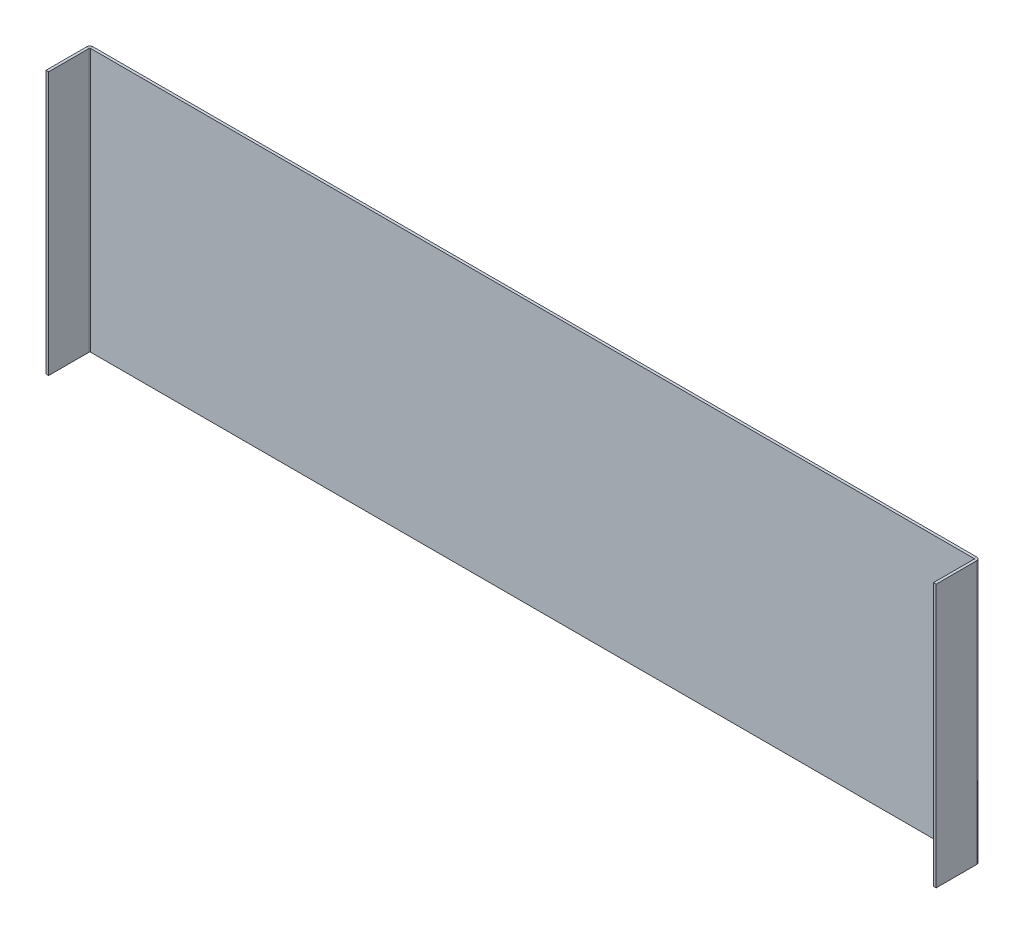
ISO-10303-21;
HEADER;
FILE_DESCRIPTION(('STEP AP214'),'2;1');
FILE_NAME('part.step','',(''),(''),'','','');
FILE_SCHEMA(('AUTOMOTIVE_DESIGN { 1 0 10303 214 1 1 1 1 }'));
ENDSEC;
DATA;
#1=APPLICATION_CONTEXT('core data for automotive mechanical design processes');
#2=APPLICATION_PROTOCOL_DEFINITION('international standard','automotive_design',2000,#1);
#3=PRODUCT_CONTEXT('',#1,'mechanical');
#4=PRODUCT('Part','Part','',(#3));
#5=PRODUCT_RELATED_PRODUCT_CATEGORY('part','',(#4));
#6=PRODUCT_DEFINITION_FORMATION('','',#4);
#7=PRODUCT_DEFINITION_CONTEXT('part definition',#1,'design');
#8=PRODUCT_DEFINITION('design','',#6,#7);
#9=PRODUCT_DEFINITION_SHAPE('','',#8);
#10=(LENGTH_UNIT() NAMED_UNIT(*) SI_UNIT(.MILLI.,.METRE.));
#11=(NAMED_UNIT(*) PLANE_ANGLE_UNIT() SI_UNIT($,.RADIAN.));
#12=(NAMED_UNIT(*) SI_UNIT($,.STERADIAN.) SOLID_ANGLE_UNIT());
#13=UNCERTAINTY_MEASURE_WITH_UNIT(LENGTH_MEASURE(1.E-05),#10,'distance_accuracy_value','');
#14=(GEOMETRIC_REPRESENTATION_CONTEXT(3) GLOBAL_UNCERTAINTY_ASSIGNED_CONTEXT((#13)) GLOBAL_UNIT_ASSIGNED_CONTEXT((#10,
#11,#12)) REPRESENTATION_CONTEXT('',''));
#15=CARTESIAN_POINT('',(0.,0.,0.));
#16=DIRECTION('',(0.,0.,1.));
#17=DIRECTION('',(1.,0.,0.));
#18=AXIS2_PLACEMENT_3D('',#15,#16,#17);
#19=CARTESIAN_POINT('',(-503.750000000009,150.,0.));
#20=DIRECTION('',(0.,1.,0.));
#21=DIRECTION('',(0.,0.,1.));
#22=AXIS2_PLACEMENT_3D('',#19,#20,#21);
#23=PLANE('',#22);
#24=DIRECTION('',(0.,0.,1.));
#25=VECTOR('',#24,1.);
#26=CARTESIAN_POINT('',(-503.750000000009,150.,0.));
#27=LINE('',#26,#25);
#28=CARTESIAN_POINT('',(-503.750000000009,150.,0.));
#29=VERTEX_POINT('',#28);
#30=CARTESIAN_POINT('',(-503.750000000009,150.,3.00000000000001));
#31=VERTEX_POINT('',#30);
#32=EDGE_CURVE('E11',#29,#31,#27,.T.);
#33=ORIENTED_EDGE('',*,*,#32,.F.);
#34=CARTESIAN_POINT('',(-503.750000000009,150.,3.75000000000002));
#35=DIRECTION('',(0.,1.,0.));
#36=DIRECTION('',(0.,0.,1.));
#37=AXIS2_PLACEMENT_3D('',#34,#35,#36);
#38=CIRCLE('',#37,3.75);
#39=CARTESIAN_POINT('',(-507.500000000009,150.,3.75000000000002));
#40=VERTEX_POINT('',#39);
#41=EDGE_CURVE('E247',#40,#29,#38,.F.);
#42=ORIENTED_EDGE('',*,*,#41,.F.);
#43=DIRECTION('',(-1.,0.,0.));
#44=VECTOR('',#43,1.);
#45=CARTESIAN_POINT('',(-504.500000000009,150.,3.75000000000002));
#46=LINE('',#45,#44);
#47=CARTESIAN_POINT('',(-504.500000000009,150.,3.75000000000002));
#48=VERTEX_POINT('',#47);
#49=EDGE_CURVE('E45',#48,#40,#46,.T.);
#50=ORIENTED_EDGE('',*,*,#49,.F.);
#51=CARTESIAN_POINT('',(-503.750000000009,150.,3.75000000000002));
#52=DIRECTION('',(0.,1.,0.));
#53=DIRECTION('',(1.,0.,0.));
#54=AXIS2_PLACEMENT_3D('',#51,#52,#53);
#55=CIRCLE('',#54,0.75);
#56=EDGE_CURVE('E146',#48,#31,#55,.F.);
#57=ORIENTED_EDGE('',*,*,#56,.T.);
#58=EDGE_LOOP('',(#33,#42,#50,#57));
#59=FACE_BOUND('',#58,.T.);
#60=ADVANCED_FACE('F37',(#59),#23,.T.);
#61=CARTESIAN_POINT('',(-504.500000000009,150.,3.75000000000002));
#62=DIRECTION('',(0.,1.,0.));
#63=DIRECTION('',(0.,0.,1.));
#64=AXIS2_PLACEMENT_3D('',#61,#62,#63);
#65=PLANE('',#64);
#66=DIRECTION('',(1.,0.,0.));
#67=VECTOR('',#66,1.);
#68=CARTESIAN_POINT('',(-507.500000000009,150.,0.));
#69=LINE('',#68,#67);
#70=CARTESIAN_POINT('',(503.750000000007,150.,0.));
#71=VERTEX_POINT('',#70);
#72=EDGE_CURVE('E140',#29,#71,#69,.T.);
#73=ORIENTED_EDGE('',*,*,#72,.F.);
#74=ORIENTED_EDGE('',*,*,#32,.T.);
#75=DIRECTION('',(1.,0.,0.));
#76=VECTOR('',#75,1.);
#77=CARTESIAN_POINT('',(-507.500000000009,150.,3.00000000000001));
#78=LINE('',#77,#76);
#79=CARTESIAN_POINT('',(503.750000000007,150.,3.00000000000001));
#80=VERTEX_POINT('',#79);
#81=EDGE_CURVE('E137',#31,#80,#78,.T.);
#82=ORIENTED_EDGE('',*,*,#81,.T.);
#83=DIRECTION('',(0.,0.,-1.));
#84=VECTOR('',#83,1.);
#85=CARTESIAN_POINT('',(503.750000000007,150.,3.00000000000001));
#86=LINE('',#85,#84);
#87=EDGE_CURVE('E228',#80,#71,#86,.T.);
#88=ORIENTED_EDGE('',*,*,#87,.T.);
#89=EDGE_LOOP('',(#73,#74,#82,#88));
#90=FACE_BOUND('',#89,.T.);
#91=ADVANCED_FACE('F135',(#90),#65,.T.);
#92=CARTESIAN_POINT('',(-507.500000000009,-150.,3.75000000000002));
#93=DIRECTION('',(0.,-1.,0.));
#94=DIRECTION('',(0.,0.,-1.));
#95=AXIS2_PLACEMENT_3D('',#92,#93,#94);
#96=PLANE('',#95);
#97=DIRECTION('',(1.,0.,0.));
#98=VECTOR('',#97,1.);
#99=CARTESIAN_POINT('',(-507.500000000009,-150.,3.75000000000002));
#100=LINE('',#99,#98);
#101=CARTESIAN_POINT('',(-507.500000000009,-150.,3.75000000000002));
#102=VERTEX_POINT('',#101);
#103=CARTESIAN_POINT('',(-504.500000000009,-150.,3.75000000000002));
#104=VERTEX_POINT('',#103);
#105=EDGE_CURVE('E233',#102,#104,#100,.T.);
#106=ORIENTED_EDGE('',*,*,#105,.F.);
#107=CARTESIAN_POINT('',(-503.750000000009,-150.,3.75000000000002));
#108=DIRECTION('',(0.,1.,0.));
#109=DIRECTION('',(0.,0.,1.));
#110=AXIS2_PLACEMENT_3D('',#107,#108,#109);
#111=CIRCLE('',#110,3.75);
#112=CARTESIAN_POINT('',(-503.750000000009,-150.,0.));
#113=VERTEX_POINT('',#112);
#114=EDGE_CURVE('E185',#102,#113,#111,.F.);
#115=ORIENTED_EDGE('',*,*,#114,.T.);
#116=DIRECTION('',(0.,0.,-1.));
#117=VECTOR('',#116,1.);
#118=CARTESIAN_POINT('',(-503.750000000009,-150.,3.00000000000001));
#119=LINE('',#118,#117);
#120=CARTESIAN_POINT('',(-503.750000000009,-150.,3.00000000000001));
#121=VERTEX_POINT('',#120);
#122=EDGE_CURVE('E231',#121,#113,#119,.T.);
#123=ORIENTED_EDGE('',*,*,#122,.F.);
#124=CARTESIAN_POINT('',(-503.750000000009,-150.,3.75000000000002));
#125=DIRECTION('',(0.,1.,0.));
#126=DIRECTION('',(1.,0.,0.));
#127=AXIS2_PLACEMENT_3D('',#124,#125,#126);
#128=CIRCLE('',#127,0.75);
#129=EDGE_CURVE('E158',#104,#121,#128,.F.);
#130=ORIENTED_EDGE('',*,*,#129,.F.);
#131=EDGE_LOOP('',(#106,#115,#123,#130));
#132=FACE_BOUND('',#131,.T.);
#133=ADVANCED_FACE('F285',(#132),#96,.T.);
#134=CARTESIAN_POINT('',(-503.750000000009,-150.,3.00000000000001));
#135=DIRECTION('',(0.,-1.,0.));
#136=DIRECTION('',(0.,0.,-1.));
#137=AXIS2_PLACEMENT_3D('',#134,#135,#136);
#138=PLANE('',#137);
#139=DIRECTION('',(0.,0.,-1.));
#140=VECTOR('',#139,1.);
#141=CARTESIAN_POINT('',(-507.500000000009,-150.,50.));
#142=LINE('',#141,#140);
#143=CARTESIAN_POINT('',(-507.500000000009,-150.,50.));
#144=VERTEX_POINT('',#143);
#145=EDGE_CURVE('E188',#144,#102,#142,.T.);
#146=ORIENTED_EDGE('',*,*,#145,.T.);
#147=ORIENTED_EDGE('',*,*,#105,.T.);
#148=DIRECTION('',(0.,0.,-1.));
#149=VECTOR('',#148,1.);
#150=CARTESIAN_POINT('',(-504.500000000009,-150.,50.));
#151=LINE('',#150,#149);
#152=CARTESIAN_POINT('',(-504.500000000009,-150.,50.));
#153=VERTEX_POINT('',#152);
#154=EDGE_CURVE('E194',#153,#104,#151,.T.);
#155=ORIENTED_EDGE('',*,*,#154,.F.);
#156=DIRECTION('',(-1.,0.,0.));
#157=VECTOR('',#156,1.);
#158=CARTESIAN_POINT('',(-504.500000000009,-150.,50.));
#159=LINE('',#158,#157);
#160=EDGE_CURVE('E191',#153,#144,#159,.T.);
#161=ORIENTED_EDGE('',*,*,#160,.T.);
#162=EDGE_LOOP('',(#146,#147,#155,#161));
#163=FACE_BOUND('',#162,.T.);
#164=ADVANCED_FACE('F288',(#163),#138,.T.);
#165=CARTESIAN_POINT('',(507.500000000007,150.,3.75000000000001));
#166=DIRECTION('',(0.,1.,0.));
#167=DIRECTION('',(0.,0.,1.));
#168=AXIS2_PLACEMENT_3D('',#165,#166,#167);
#169=PLANE('',#168);
#170=DIRECTION('',(-1.,0.,0.));
#171=VECTOR('',#170,1.);
#172=CARTESIAN_POINT('',(507.500000000007,150.,3.75000000000001));
#173=LINE('',#172,#171);
#174=CARTESIAN_POINT('',(507.500000000007,150.,3.75000000000001));
#175=VERTEX_POINT('',#174);
#176=CARTESIAN_POINT('',(504.500000000007,150.,3.75000000000001));
#177=VERTEX_POINT('',#176);
#178=EDGE_CURVE('E53',#175,#177,#173,.T.);
#179=ORIENTED_EDGE('',*,*,#178,.F.);
#180=CARTESIAN_POINT('',(503.750000000007,150.,3.75000000000001));
#181=DIRECTION('',(0.,1.,0.));
#182=DIRECTION('',(0.,0.,1.));
#183=AXIS2_PLACEMENT_3D('',#180,#181,#182);
#184=CIRCLE('',#183,3.75);
#185=EDGE_CURVE('E257',#71,#175,#184,.F.);
#186=ORIENTED_EDGE('',*,*,#185,.F.);
#187=ORIENTED_EDGE('',*,*,#87,.F.);
#188=CARTESIAN_POINT('',(503.750000000007,150.,3.75000000000001));
#189=DIRECTION('',(0.,1.,0.));
#190=DIRECTION('',(1.,0.,0.));
#191=AXIS2_PLACEMENT_3D('',#188,#189,#190);
#192=CIRCLE('',#191,0.75);
#193=EDGE_CURVE('E166',#80,#177,#192,.F.);
#194=ORIENTED_EDGE('',*,*,#193,.T.);
#195=EDGE_LOOP('',(#179,#186,#187,#194));
#196=FACE_BOUND('',#195,.T.);
#197=ADVANCED_FACE('F280',(#196),#169,.T.);
#198=CARTESIAN_POINT('',(503.750000000007,150.,3.00000000000001));
#199=DIRECTION('',(0.,1.,0.));
#200=DIRECTION('',(0.,0.,1.));
#201=AXIS2_PLACEMENT_3D('',#198,#199,#200);
#202=PLANE('',#201);
#203=DIRECTION('',(0.,0.,1.));
#204=VECTOR('',#203,1.);
#205=CARTESIAN_POINT('',(507.500000000007,150.,0.));
#206=LINE('',#205,#204);
#207=CARTESIAN_POINT('',(507.500000000007,150.,50.));
#208=VERTEX_POINT('',#207);
#209=EDGE_CURVE('E260',#175,#208,#206,.T.);
#210=ORIENTED_EDGE('',*,*,#209,.F.);
#211=ORIENTED_EDGE('',*,*,#178,.T.);
#212=DIRECTION('',(0.,0.,-1.));
#213=VECTOR('',#212,1.);
#214=CARTESIAN_POINT('',(504.500000000007,150.,0.));
#215=LINE('',#214,#213);
#216=CARTESIAN_POINT('',(504.500000000007,150.,50.));
#217=VERTEX_POINT('',#216);
#218=EDGE_CURVE('E107',#177,#217,#215,.F.);
#219=ORIENTED_EDGE('',*,*,#218,.T.);
#220=DIRECTION('',(-1.,0.,0.));
#221=VECTOR('',#220,1.);
#222=CARTESIAN_POINT('',(507.500000000007,150.,50.));
#223=LINE('',#222,#221);
#224=EDGE_CURVE('E263',#208,#217,#223,.T.);
#225=ORIENTED_EDGE('',*,*,#224,.F.);
#226=EDGE_LOOP('',(#210,#211,#219,#225));
#227=FACE_BOUND('',#226,.T.);
#228=ADVANCED_FACE('F269',(#227),#202,.T.);
#229=CARTESIAN_POINT('',(503.750000000007,-150.,0.));
#230=DIRECTION('',(0.,-1.,0.));
#231=DIRECTION('',(0.,0.,-1.));
#232=AXIS2_PLACEMENT_3D('',#229,#230,#231);
#233=PLANE('',#232);
#234=DIRECTION('',(0.,0.,1.));
#235=VECTOR('',#234,1.);
#236=CARTESIAN_POINT('',(503.750000000007,-150.,0.));
#237=LINE('',#236,#235);
#238=CARTESIAN_POINT('',(503.750000000007,-150.,0.));
#239=VERTEX_POINT('',#238);
#240=CARTESIAN_POINT('',(503.750000000007,-150.,3.00000000000001));
#241=VERTEX_POINT('',#240);
#242=EDGE_CURVE('E94',#239,#241,#237,.T.);
#243=ORIENTED_EDGE('',*,*,#242,.F.);
#244=CARTESIAN_POINT('',(503.750000000007,-150.,3.75000000000001));
#245=DIRECTION('',(0.,1.,0.));
#246=DIRECTION('',(0.,0.,1.));
#247=AXIS2_PLACEMENT_3D('',#244,#245,#246);
#248=CIRCLE('',#247,3.75);
#249=CARTESIAN_POINT('',(507.500000000007,-150.,3.75000000000001));
#250=VERTEX_POINT('',#249);
#251=EDGE_CURVE('E181',#239,#250,#248,.F.);
#252=ORIENTED_EDGE('',*,*,#251,.T.);
#253=DIRECTION('',(1.,0.,0.));
#254=VECTOR('',#253,1.);
#255=CARTESIAN_POINT('',(504.500000000007,-150.,3.75000000000001));
#256=LINE('',#255,#254);
#257=CARTESIAN_POINT('',(504.500000000007,-150.,3.75000000000001));
#258=VERTEX_POINT('',#257);
#259=EDGE_CURVE('E101',#258,#250,#256,.T.);
#260=ORIENTED_EDGE('',*,*,#259,.F.);
#261=CARTESIAN_POINT('',(503.750000000007,-150.,3.75000000000001));
#262=DIRECTION('',(0.,1.,0.));
#263=DIRECTION('',(1.,0.,0.));
#264=AXIS2_PLACEMENT_3D('',#261,#262,#263);
#265=CIRCLE('',#264,0.75);
#266=EDGE_CURVE('E200',#241,#258,#265,.F.);
#267=ORIENTED_EDGE('',*,*,#266,.F.);
#268=EDGE_LOOP('',(#243,#252,#260,#267));
#269=FACE_BOUND('',#268,.T.);
#270=ADVANCED_FACE('F317',(#269),#233,.T.);
#271=CARTESIAN_POINT('',(504.500000000007,-150.,3.75000000000001));
#272=DIRECTION('',(0.,-1.,0.));
#273=DIRECTION('',(0.,0.,-1.));
#274=AXIS2_PLACEMENT_3D('',#271,#272,#273);
#275=PLANE('',#274);
#276=DIRECTION('',(1.,0.,0.));
#277=VECTOR('',#276,1.);
#278=CARTESIAN_POINT('',(-507.500000000009,-150.,0.));
#279=LINE('',#278,#277);
#280=EDGE_CURVE('E183',#113,#239,#279,.T.);
#281=ORIENTED_EDGE('',*,*,#280,.T.);
#282=ORIENTED_EDGE('',*,*,#242,.T.);
#283=DIRECTION('',(1.,0.,0.));
#284=VECTOR('',#283,1.);
#285=CARTESIAN_POINT('',(-507.500000000009,-150.,3.00000000000001));
#286=LINE('',#285,#284);
#287=EDGE_CURVE('E198',#121,#241,#286,.T.);
#288=ORIENTED_EDGE('',*,*,#287,.F.);
#289=ORIENTED_EDGE('',*,*,#122,.T.);
#290=EDGE_LOOP('',(#281,#282,#288,#289));
#291=FACE_BOUND('',#290,.T.);
#292=ADVANCED_FACE('F320',(#291),#275,.T.);
#293=CARTESIAN_POINT('',(504.500000000007,150.,0.));
#294=DIRECTION('',(1.,0.,0.));
#295=DIRECTION('',(0.,0.,-1.));
#296=AXIS2_PLACEMENT_3D('',#293,#294,#295);
#297=PLANE('',#296);
#298=DIRECTION('',(0.,0.,-1.));
#299=VECTOR('',#298,1.);
#300=CARTESIAN_POINT('',(504.500000000007,-150.,0.));
#301=LINE('',#300,#299);
#302=CARTESIAN_POINT('',(504.500000000007,-150.,50.));
#303=VERTEX_POINT('',#302);
#304=EDGE_CURVE('E172',#258,#303,#301,.F.);
#305=ORIENTED_EDGE('',*,*,#304,.T.);
#306=DIRECTION('',(0.,-1.,0.));
#307=VECTOR('',#306,1.);
#308=CARTESIAN_POINT('',(504.500000000007,150.,50.));
#309=LINE('',#308,#307);
#310=EDGE_CURVE('E224',#217,#303,#309,.T.);
#311=ORIENTED_EDGE('',*,*,#310,.F.);
#312=ORIENTED_EDGE('',*,*,#218,.F.);
#313=DIRECTION('',(0.,-1.,0.));
#314=VECTOR('',#313,1.);
#315=CARTESIAN_POINT('',(504.500000000007,150.,3.75000000000001));
#316=LINE('',#315,#314);
#317=EDGE_CURVE('E168',#177,#258,#316,.T.);
#318=ORIENTED_EDGE('',*,*,#317,.T.);
#319=EDGE_LOOP('',(#305,#311,#312,#318));
#320=FACE_BOUND('',#319,.T.);
#321=ADVANCED_FACE('F323',(#320),#297,.F.);
#322=CARTESIAN_POINT('',(507.500000000007,150.,50.));
#323=DIRECTION('',(0.,0.,1.));
#324=DIRECTION('',(1.,0.,0.));
#325=AXIS2_PLACEMENT_3D('',#322,#323,#324);
#326=PLANE('',#325);
#327=DIRECTION('',(-1.,0.,0.));
#328=VECTOR('',#327,1.);
#329=CARTESIAN_POINT('',(507.500000000007,-150.,50.));
#330=LINE('',#329,#328);
#331=CARTESIAN_POINT('',(507.500000000007,-150.,50.));
#332=VERTEX_POINT('',#331);
#333=EDGE_CURVE('E175',#332,#303,#330,.T.);
#334=ORIENTED_EDGE('',*,*,#333,.F.);
#335=DIRECTION('',(0.,-1.,0.));
#336=VECTOR('',#335,1.);
#337=CARTESIAN_POINT('',(507.500000000007,150.,50.));
#338=LINE('',#337,#336);
#339=EDGE_CURVE('E222',#208,#332,#338,.T.);
#340=ORIENTED_EDGE('',*,*,#339,.F.);
#341=ORIENTED_EDGE('',*,*,#224,.T.);
#342=ORIENTED_EDGE('',*,*,#310,.T.);
#343=EDGE_LOOP('',(#334,#340,#341,#342));
#344=FACE_BOUND('',#343,.T.);
#345=ADVANCED_FACE('F268',(#344),#326,.T.);
#346=CARTESIAN_POINT('',(507.500000000007,150.,0.));
#347=DIRECTION('',(1.,0.,0.));
#348=DIRECTION('',(0.,0.,-1.));
#349=AXIS2_PLACEMENT_3D('',#346,#347,#348);
#350=PLANE('',#349);
#351=DIRECTION('',(0.,0.,1.));
#352=VECTOR('',#351,1.);
#353=CARTESIAN_POINT('',(507.500000000007,-150.,0.));
#354=LINE('',#353,#352);
#355=EDGE_CURVE('E178',#250,#332,#354,.T.);
#356=ORIENTED_EDGE('',*,*,#355,.F.);
#357=DIRECTION('',(0.,-1.,0.));
#358=VECTOR('',#357,1.);
#359=CARTESIAN_POINT('',(507.500000000007,150.,3.75000000000001));
#360=LINE('',#359,#358);
#361=EDGE_CURVE('E219',#175,#250,#360,.T.);
#362=ORIENTED_EDGE('',*,*,#361,.F.);
#363=ORIENTED_EDGE('',*,*,#209,.T.);
#364=ORIENTED_EDGE('',*,*,#339,.T.);
#365=EDGE_LOOP('',(#356,#362,#363,#364));
#366=FACE_BOUND('',#365,.T.);
#367=ADVANCED_FACE('F273',(#366),#350,.T.);
#368=CARTESIAN_POINT('',(503.750000000007,150.,3.75000000000001));
#369=DIRECTION('',(0.,-1.,0.));
#370=DIRECTION('',(0.,0.,-1.));
#371=AXIS2_PLACEMENT_3D('',#368,#369,#370);
#372=CYLINDRICAL_SURFACE('',#371,3.75);
#373=ORIENTED_EDGE('',*,*,#251,.F.);
#374=DIRECTION('',(0.,-1.,0.));
#375=VECTOR('',#374,1.);
#376=CARTESIAN_POINT('',(503.750000000007,150.,0.));
#377=LINE('',#376,#375);
#378=EDGE_CURVE('E216',#71,#239,#377,.T.);
#379=ORIENTED_EDGE('',*,*,#378,.F.);
#380=ORIENTED_EDGE('',*,*,#185,.T.);
#381=ORIENTED_EDGE('',*,*,#361,.T.);
#382=EDGE_LOOP('',(#373,#379,#380,#381));
#383=FACE_BOUND('',#382,.T.);
#384=ADVANCED_FACE('F276',(#383),#372,.T.);
#385=CARTESIAN_POINT('',(-507.500000000009,150.,0.));
#386=DIRECTION('',(0.,0.,-1.));
#387=DIRECTION('',(-1.,0.,0.));
#388=AXIS2_PLACEMENT_3D('',#385,#386,#387);
#389=PLANE('',#388);
#390=ORIENTED_EDGE('',*,*,#280,.F.);
#391=DIRECTION('',(0.,-1.,0.));
#392=VECTOR('',#391,1.);
#393=CARTESIAN_POINT('',(-503.750000000009,150.,0.));
#394=LINE('',#393,#392);
#395=EDGE_CURVE('E213',#29,#113,#394,.T.);
#396=ORIENTED_EDGE('',*,*,#395,.F.);
#397=ORIENTED_EDGE('',*,*,#72,.T.);
#398=ORIENTED_EDGE('',*,*,#378,.T.);
#399=EDGE_LOOP('',(#390,#396,#397,#398));
#400=FACE_BOUND('',#399,.T.);
#401=ADVANCED_FACE('F283',(#400),#389,.T.);
#402=CARTESIAN_POINT('',(-503.750000000009,150.,3.75000000000002));
#403=DIRECTION('',(0.,-1.,0.));
#404=DIRECTION('',(0.,0.,-1.));
#405=AXIS2_PLACEMENT_3D('',#402,#403,#404);
#406=CYLINDRICAL_SURFACE('',#405,3.75);
#407=ORIENTED_EDGE('',*,*,#114,.F.);
#408=DIRECTION('',(0.,-1.,0.));
#409=VECTOR('',#408,1.);
#410=CARTESIAN_POINT('',(-507.500000000009,150.,3.75000000000002));
#411=LINE('',#410,#409);
#412=EDGE_CURVE('E210',#40,#102,#411,.T.);
#413=ORIENTED_EDGE('',*,*,#412,.F.);
#414=ORIENTED_EDGE('',*,*,#41,.T.);
#415=ORIENTED_EDGE('',*,*,#395,.T.);
#416=EDGE_LOOP('',(#407,#413,#414,#415));
#417=FACE_BOUND('',#416,.T.);
#418=ADVANCED_FACE('F246',(#417),#406,.T.);
#419=CARTESIAN_POINT('',(-507.500000000009,150.,50.));
#420=DIRECTION('',(-1.,0.,0.));
#421=DIRECTION('',(0.,0.,1.));
#422=AXIS2_PLACEMENT_3D('',#419,#420,#421);
#423=PLANE('',#422);
#424=ORIENTED_EDGE('',*,*,#145,.F.);
#425=DIRECTION('',(0.,-1.,0.));
#426=VECTOR('',#425,1.);
#427=CARTESIAN_POINT('',(-507.500000000009,150.,50.));
#428=LINE('',#427,#426);
#429=CARTESIAN_POINT('',(-507.500000000009,150.,50.));
#430=VERTEX_POINT('',#429);
#431=EDGE_CURVE('E208',#430,#144,#428,.T.);
#432=ORIENTED_EDGE('',*,*,#431,.F.);
#433=DIRECTION('',(0.,0.,-1.));
#434=VECTOR('',#433,1.);
#435=CARTESIAN_POINT('',(-507.500000000009,150.,50.));
#436=LINE('',#435,#434);
#437=EDGE_CURVE('E240',#430,#40,#436,.T.);
#438=ORIENTED_EDGE('',*,*,#437,.T.);
#439=ORIENTED_EDGE('',*,*,#412,.T.);
#440=EDGE_LOOP('',(#424,#432,#438,#439));
#441=FACE_BOUND('',#440,.T.);
#442=ADVANCED_FACE('F251',(#441),#423,.T.);
#443=CARTESIAN_POINT('',(-504.500000000009,150.,50.));
#444=DIRECTION('',(0.,0.,1.));
#445=DIRECTION('',(1.,0.,0.));
#446=AXIS2_PLACEMENT_3D('',#443,#444,#445);
#447=PLANE('',#446);
#448=ORIENTED_EDGE('',*,*,#160,.F.);
#449=DIRECTION('',(0.,-1.,0.));
#450=VECTOR('',#449,1.);
#451=CARTESIAN_POINT('',(-504.500000000009,150.,50.));
#452=LINE('',#451,#450);
#453=CARTESIAN_POINT('',(-504.500000000009,150.,50.));
#454=VERTEX_POINT('',#453);
#455=EDGE_CURVE('E206',#454,#153,#452,.T.);
#456=ORIENTED_EDGE('',*,*,#455,.F.);
#457=DIRECTION('',(-1.,0.,0.));
#458=VECTOR('',#457,1.);
#459=CARTESIAN_POINT('',(-504.500000000009,150.,50.));
#460=LINE('',#459,#458);
#461=EDGE_CURVE('E252',#454,#430,#460,.T.);
#462=ORIENTED_EDGE('',*,*,#461,.T.);
#463=ORIENTED_EDGE('',*,*,#431,.T.);
#464=EDGE_LOOP('',(#448,#456,#462,#463));
#465=FACE_BOUND('',#464,.T.);
#466=ADVANCED_FACE('F293',(#465),#447,.T.);
#467=CARTESIAN_POINT('',(-504.500000000009,150.,50.));
#468=DIRECTION('',(-1.,0.,0.));
#469=DIRECTION('',(0.,0.,1.));
#470=AXIS2_PLACEMENT_3D('',#467,#468,#469);
#471=PLANE('',#470);
#472=ORIENTED_EDGE('',*,*,#154,.T.);
#473=DIRECTION('',(0.,-1.,0.));
#474=VECTOR('',#473,1.);
#475=CARTESIAN_POINT('',(-504.500000000009,150.,3.75000000000002));
#476=LINE('',#475,#474);
#477=EDGE_CURVE('E160',#48,#104,#476,.T.);
#478=ORIENTED_EDGE('',*,*,#477,.F.);
#479=DIRECTION('',(0.,0.,-1.));
#480=VECTOR('',#479,1.);
#481=CARTESIAN_POINT('',(-504.500000000009,150.,50.));
#482=LINE('',#481,#480);
#483=EDGE_CURVE('E151',#454,#48,#482,.T.);
#484=ORIENTED_EDGE('',*,*,#483,.F.);
#485=ORIENTED_EDGE('',*,*,#455,.T.);
#486=EDGE_LOOP('',(#472,#478,#484,#485));
#487=FACE_BOUND('',#486,.T.);
#488=ADVANCED_FACE('F291',(#487),#471,.F.);
#489=CARTESIAN_POINT('',(-503.750000000009,150.,3.75000000000002));
#490=DIRECTION('',(0.,-1.,0.));
#491=DIRECTION('',(0.,0.,-1.));
#492=AXIS2_PLACEMENT_3D('',#489,#490,#491);
#493=CYLINDRICAL_SURFACE('',#492,0.75);
#494=ORIENTED_EDGE('',*,*,#129,.T.);
#495=DIRECTION('',(0.,-1.,0.));
#496=VECTOR('',#495,1.);
#497=CARTESIAN_POINT('',(-503.750000000009,150.,3.00000000000001));
#498=LINE('',#497,#496);
#499=EDGE_CURVE('E155',#31,#121,#498,.T.);
#500=ORIENTED_EDGE('',*,*,#499,.F.);
#501=ORIENTED_EDGE('',*,*,#56,.F.);
#502=ORIENTED_EDGE('',*,*,#477,.T.);
#503=EDGE_LOOP('',(#494,#500,#501,#502));
#504=FACE_BOUND('',#503,.T.);
#505=ADVANCED_FACE('F156',(#504),#493,.F.);
#506=CARTESIAN_POINT('',(-507.500000000009,150.,3.00000000000001));
#507=DIRECTION('',(0.,0.,-1.));
#508=DIRECTION('',(-1.,0.,0.));
#509=AXIS2_PLACEMENT_3D('',#506,#507,#508);
#510=PLANE('',#509);
#511=ORIENTED_EDGE('',*,*,#287,.T.);
#512=DIRECTION('',(0.,-1.,0.));
#513=VECTOR('',#512,1.);
#514=CARTESIAN_POINT('',(503.750000000007,150.,3.00000000000001));
#515=LINE('',#514,#513);
#516=EDGE_CURVE('E161',#80,#241,#515,.T.);
#517=ORIENTED_EDGE('',*,*,#516,.F.);
#518=ORIENTED_EDGE('',*,*,#81,.F.);
#519=ORIENTED_EDGE('',*,*,#499,.T.);
#520=EDGE_LOOP('',(#511,#517,#518,#519));
#521=FACE_BOUND('',#520,.T.);
#522=ADVANCED_FACE('F163',(#521),#510,.F.);
#523=CARTESIAN_POINT('',(503.750000000007,150.,3.75000000000001));
#524=DIRECTION('',(0.,-1.,0.));
#525=DIRECTION('',(0.,0.,-1.));
#526=AXIS2_PLACEMENT_3D('',#523,#524,#525);
#527=CYLINDRICAL_SURFACE('',#526,0.75);
#528=ORIENTED_EDGE('',*,*,#266,.T.);
#529=ORIENTED_EDGE('',*,*,#317,.F.);
#530=ORIENTED_EDGE('',*,*,#193,.F.);
#531=ORIENTED_EDGE('',*,*,#516,.T.);
#532=EDGE_LOOP('',(#528,#529,#530,#531));
#533=FACE_BOUND('',#532,.T.);
#534=ADVANCED_FACE('F375',(#533),#527,.F.);
#535=CARTESIAN_POINT('',(503.750000000007,150.,3.75000000000001));
#536=DIRECTION('',(0.,1.,0.));
#537=DIRECTION('',(1.,0.,0.));
#538=AXIS2_PLACEMENT_3D('',#535,#536,#537);
#539=PLANE('',#538);
#540=ORIENTED_EDGE('',*,*,#483,.T.);
#541=ORIENTED_EDGE('',*,*,#49,.T.);
#542=ORIENTED_EDGE('',*,*,#437,.F.);
#543=ORIENTED_EDGE('',*,*,#461,.F.);
#544=EDGE_LOOP('',(#540,#541,#542,#543));
#545=FACE_BOUND('',#544,.T.);
#546=ADVANCED_FACE('F237',(#545),#539,.T.);
#547=CARTESIAN_POINT('',(503.750000000007,-150.,3.75000000000001));
#548=DIRECTION('',(0.,1.,0.));
#549=DIRECTION('',(1.,0.,0.));
#550=AXIS2_PLACEMENT_3D('',#547,#548,#549);
#551=PLANE('',#550);
#552=ORIENTED_EDGE('',*,*,#304,.F.);
#553=ORIENTED_EDGE('',*,*,#259,.T.);
#554=ORIENTED_EDGE('',*,*,#355,.T.);
#555=ORIENTED_EDGE('',*,*,#333,.T.);
#556=EDGE_LOOP('',(#552,#553,#554,#555));
#557=FACE_BOUND('',#556,.T.);
#558=ADVANCED_FACE('F395',(#557),#551,.F.);
#559=CLOSED_SHELL('',(#60,#91,#133,#164,#197,#228,#270,#292,#321,#345,#367,#384,#401,#418,#442,
#466,#488,#505,#522,#534,#546,#558));
#560=MANIFOLD_SOLID_BREP('B2',#559);
#561=ADVANCED_BREP_SHAPE_REPRESENTATION('',(#18,#560),#14);
#562=SHAPE_DEFINITION_REPRESENTATION(#9,#561);
ENDSEC;
END-ISO-10303-21;
